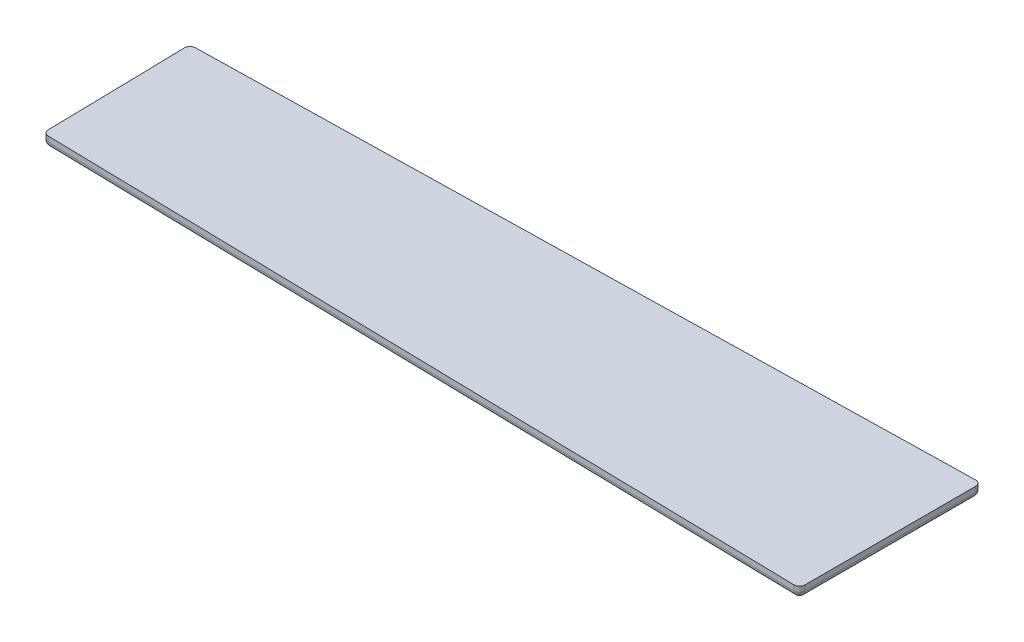
ISO-10303-21;
HEADER;
FILE_DESCRIPTION(('STEP AP214'),'2;1');
FILE_NAME('part.step','',(''),(''),'','','');
FILE_SCHEMA(('AUTOMOTIVE_DESIGN { 1 0 10303 214 1 1 1 1 }'));
ENDSEC;
DATA;
#1=APPLICATION_CONTEXT('core data for automotive mechanical design processes');
#2=APPLICATION_PROTOCOL_DEFINITION('international standard','automotive_design',2000,#1);
#3=PRODUCT_CONTEXT('',#1,'mechanical');
#4=PRODUCT('Part','Part','',(#3));
#5=PRODUCT_RELATED_PRODUCT_CATEGORY('part','',(#4));
#6=PRODUCT_DEFINITION_FORMATION('','',#4);
#7=PRODUCT_DEFINITION_CONTEXT('part definition',#1,'design');
#8=PRODUCT_DEFINITION('design','',#6,#7);
#9=PRODUCT_DEFINITION_SHAPE('','',#8);
#10=(LENGTH_UNIT() NAMED_UNIT(*) SI_UNIT(.MILLI.,.METRE.));
#11=(NAMED_UNIT(*) PLANE_ANGLE_UNIT() SI_UNIT($,.RADIAN.));
#12=(NAMED_UNIT(*) SI_UNIT($,.STERADIAN.) SOLID_ANGLE_UNIT());
#13=UNCERTAINTY_MEASURE_WITH_UNIT(LENGTH_MEASURE(1.E-05),#10,'distance_accuracy_value','');
#14=(GEOMETRIC_REPRESENTATION_CONTEXT(3) GLOBAL_UNCERTAINTY_ASSIGNED_CONTEXT((#13)) GLOBAL_UNIT_ASSIGNED_CONTEXT((#10,
#11,#12)) REPRESENTATION_CONTEXT('',''));
#15=CARTESIAN_POINT('',(0.,0.,0.));
#16=DIRECTION('',(0.,0.,1.));
#17=DIRECTION('',(1.,0.,0.));
#18=AXIS2_PLACEMENT_3D('',#15,#16,#17);
#19=CARTESIAN_POINT('',(92.0552909940542,2.54,-21.59));
#20=DIRECTION('',(0.0206896551724107,0.,0.999785946174903));
#21=DIRECTION('',(0.999785946174903,0.,-0.0206896551724107));
#22=AXIS2_PLACEMENT_3D('',#19,#20,#21);
#23=PLANE('',#22);
#24=DIRECTION('',(-0.999785946174903,0.,0.0206896551724107));
#25=VECTOR('',#24,1.);
#26=CARTESIAN_POINT('',(92.0552909940542,1.27,-21.59));
#27=LINE('',#26,#25);
#28=CARTESIAN_POINT('',(90.7590151319853,1.27,-21.5631747573597));
#29=VERTEX_POINT('',#28);
#30=CARTESIAN_POINT('',(-90.7855628424121,1.27,-17.8062758620695));
#31=VERTEX_POINT('',#30);
#32=EDGE_CURVE('E169',#29,#31,#27,.T.);
#33=ORIENTED_EDGE('',*,*,#32,.T.);
#34=DIRECTION('',(0.,-1.,0.));
#35=VECTOR('',#34,1.);
#36=CARTESIAN_POINT('',(-90.7855628424121,2.54,-17.8062758620695));
#37=LINE('',#36,#35);
#38=CARTESIAN_POINT('',(-90.7855628424121,2.54,-17.8062758620695));
#39=VERTEX_POINT('',#38);
#40=EDGE_CURVE('E209',#31,#39,#37,.F.);
#41=ORIENTED_EDGE('',*,*,#40,.T.);
#42=DIRECTION('',(-0.999785946174903,0.,0.0206896551724107));
#43=VECTOR('',#42,1.);
#44=CARTESIAN_POINT('',(92.0552909940542,2.54,-21.59));
#45=LINE('',#44,#43);
#46=CARTESIAN_POINT('',(90.7590151319853,2.54,-21.5631747573597));
#47=VERTEX_POINT('',#46);
#48=EDGE_CURVE('E234',#47,#39,#45,.T.);
#49=ORIENTED_EDGE('',*,*,#48,.F.);
#50=DIRECTION('',(0.,-1.,0.));
#51=VECTOR('',#50,1.);
#52=CARTESIAN_POINT('',(90.7590151319853,2.54,-21.5631747573597));
#53=LINE('',#52,#51);
#54=EDGE_CURVE('E206',#47,#29,#53,.T.);
#55=ORIENTED_EDGE('',*,*,#54,.T.);
#56=EDGE_LOOP('',(#33,#41,#49,#55));
#57=FACE_BOUND('',#56,.T.);
#58=ADVANCED_FACE('F46',(#57),#23,.F.);
#59=CARTESIAN_POINT('',(-92.0552909940542,2.54,-17.7800000000006));
#60=DIRECTION('',(0.999785946174903,0.,-0.0206896551724128));
#61=DIRECTION('',(-0.0206896551724128,0.,-0.999785946174903));
#62=AXIS2_PLACEMENT_3D('',#59,#60,#61);
#63=PLANE('',#62);
#64=DIRECTION('',(0.0206896551724128,0.,0.999785946174903));
#65=VECTOR('',#64,1.);
#66=CARTESIAN_POINT('',(-92.0552909940542,2.54,-17.7800000000006));
#67=LINE('',#66,#65);
#68=CARTESIAN_POINT('',(-92.0290151319853,2.54,-16.5102718483584));
#69=VERTEX_POINT('',#68);
#70=CARTESIAN_POINT('',(-91.3443044660526,2.54,16.5769930330941));
#71=VERTEX_POINT('',#70);
#72=EDGE_CURVE('E278',#69,#71,#67,.T.);
#73=ORIENTED_EDGE('',*,*,#72,.F.);
#74=DIRECTION('',(0.,-1.,0.));
#75=VECTOR('',#74,1.);
#76=CARTESIAN_POINT('',(-92.0290151319853,2.54,-16.5102718483584));
#77=LINE('',#76,#75);
#78=CARTESIAN_POINT('',(-92.0290151319853,1.27,-16.5102718483584));
#79=VERTEX_POINT('',#78);
#80=EDGE_CURVE('E203',#69,#79,#77,.T.);
#81=ORIENTED_EDGE('',*,*,#80,.T.);
#82=DIRECTION('',(0.0206896551724128,0.,0.999785946174903));
#83=VECTOR('',#82,1.);
#84=CARTESIAN_POINT('',(-92.0552909940542,1.27,-17.7800000000006));
#85=LINE('',#84,#83);
#86=CARTESIAN_POINT('',(-91.3443044660526,1.27,16.5769930330941));
#87=VERTEX_POINT('',#86);
#88=EDGE_CURVE('E174',#79,#87,#85,.T.);
#89=ORIENTED_EDGE('',*,*,#88,.T.);
#90=DIRECTION('',(0.,-1.,0.));
#91=VECTOR('',#90,1.);
#92=CARTESIAN_POINT('',(-91.3443044660526,2.54,16.5769930330941));
#93=LINE('',#92,#91);
#94=EDGE_CURVE('E150',#87,#71,#93,.F.);
#95=ORIENTED_EDGE('',*,*,#94,.T.);
#96=EDGE_LOOP('',(#73,#81,#89,#95));
#97=FACE_BOUND('',#96,.T.);
#98=ADVANCED_FACE('F300',(#97),#63,.F.);
#99=CARTESIAN_POINT('',(-91.3190940650782,2.54,17.7952349216928));
#100=DIRECTION('',(0.0206896551724138,0.,-0.999785946174903));
#101=DIRECTION('',(-0.999785946174903,0.,-0.0206896551724138));
#102=AXIS2_PLACEMENT_3D('',#99,#100,#101);
#103=PLANE('',#102);
#104=DIRECTION('',(0.999785946174903,0.,0.0206896551724138));
#105=VECTOR('',#104,1.);
#106=CARTESIAN_POINT('',(-91.3190940650782,2.54,17.7952349216928));
#107=LINE('',#106,#105);
#108=CARTESIAN_POINT('',(-90.1008521764794,2.54,17.8204453226672));
#109=VERTEX_POINT('',#108);
#110=CARTESIAN_POINT('',(90.7590151319853,2.54,21.5631747573597));
#111=VERTEX_POINT('',#110);
#112=EDGE_CURVE('E253',#109,#111,#107,.T.);
#113=ORIENTED_EDGE('',*,*,#112,.F.);
#114=DIRECTION('',(0.,-1.,0.));
#115=VECTOR('',#114,1.);
#116=CARTESIAN_POINT('',(-90.1008521764794,2.54,17.8204453226672));
#117=LINE('',#116,#115);
#118=CARTESIAN_POINT('',(-90.1008521764794,1.27,17.8204453226672));
#119=VERTEX_POINT('',#118);
#120=EDGE_CURVE('E226',#109,#119,#117,.T.);
#121=ORIENTED_EDGE('',*,*,#120,.T.);
#122=DIRECTION('',(0.999785946174903,0.,0.0206896551724138));
#123=VECTOR('',#122,1.);
#124=CARTESIAN_POINT('',(-91.3190940650782,1.27,17.7952349216928));
#125=LINE('',#124,#123);
#126=CARTESIAN_POINT('',(90.7590151319853,1.27,21.5631747573597));
#127=VERTEX_POINT('',#126);
#128=EDGE_CURVE('E182',#119,#127,#125,.T.);
#129=ORIENTED_EDGE('',*,*,#128,.T.);
#130=DIRECTION('',(0.,-1.,0.));
#131=VECTOR('',#130,1.);
#132=CARTESIAN_POINT('',(90.7590151319853,2.54,21.5631747573597));
#133=LINE('',#132,#131);
#134=EDGE_CURVE('E223',#127,#111,#133,.F.);
#135=ORIENTED_EDGE('',*,*,#134,.T.);
#136=EDGE_LOOP('',(#113,#121,#129,#135));
#137=FACE_BOUND('',#136,.T.);
#138=ADVANCED_FACE('F290',(#137),#103,.F.);
#139=CARTESIAN_POINT('',(92.0552909940542,2.54,21.59));
#140=DIRECTION('',(-1.,0.,0.));
#141=DIRECTION('',(0.,0.,1.));
#142=AXIS2_PLACEMENT_3D('',#139,#140,#141);
#143=PLANE('',#142);
#144=DIRECTION('',(0.,0.,-1.));
#145=VECTOR('',#144,1.);
#146=CARTESIAN_POINT('',(92.0552909940542,2.54,21.59));
#147=LINE('',#146,#145);
#148=CARTESIAN_POINT('',(92.0552909940542,2.54,20.2934466057175));
#149=VERTEX_POINT('',#148);
#150=CARTESIAN_POINT('',(92.0552909940542,2.54,-20.2934466057176));
#151=VERTEX_POINT('',#150);
#152=EDGE_CURVE('E250',#149,#151,#147,.T.);
#153=ORIENTED_EDGE('',*,*,#152,.F.);
#154=DIRECTION('',(0.,-1.,0.));
#155=VECTOR('',#154,1.);
#156=CARTESIAN_POINT('',(92.0552909940542,2.54,20.2934466057175));
#157=LINE('',#156,#155);
#158=CARTESIAN_POINT('',(92.0552909940542,1.27,20.2934466057175));
#159=VERTEX_POINT('',#158);
#160=EDGE_CURVE('E11',#149,#159,#157,.T.);
#161=ORIENTED_EDGE('',*,*,#160,.T.);
#162=DIRECTION('',(0.,0.,-1.));
#163=VECTOR('',#162,1.);
#164=CARTESIAN_POINT('',(92.0552909940542,1.27,21.59));
#165=LINE('',#164,#163);
#166=CARTESIAN_POINT('',(92.0552909940542,1.27,-20.2934466057176));
#167=VERTEX_POINT('',#166);
#168=EDGE_CURVE('E148',#159,#167,#165,.T.);
#169=ORIENTED_EDGE('',*,*,#168,.T.);
#170=DIRECTION('',(0.,-1.,0.));
#171=VECTOR('',#170,1.);
#172=CARTESIAN_POINT('',(92.0552909940542,2.54,-20.2934466057176));
#173=LINE('',#172,#171);
#174=EDGE_CURVE('E56',#167,#151,#173,.F.);
#175=ORIENTED_EDGE('',*,*,#174,.T.);
#176=EDGE_LOOP('',(#153,#161,#169,#175));
#177=FACE_BOUND('',#176,.T.);
#178=ADVANCED_FACE('F247',(#177),#143,.F.);
#179=CARTESIAN_POINT('',(0.,2.54,0.));
#180=DIRECTION('',(0.,1.,0.));
#181=DIRECTION('',(0.,0.,1.));
#182=AXIS2_PLACEMENT_3D('',#179,#180,#181);
#183=PLANE('',#182);
#184=ORIENTED_EDGE('',*,*,#48,.T.);
#185=CARTESIAN_POINT('',(-90.7592869803431,2.54,-16.5365477104274));
#186=DIRECTION('',(0.,1.,0.));
#187=DIRECTION('',(0.,0.,1.));
#188=AXIS2_PLACEMENT_3D('',#185,#186,#187);
#189=CIRCLE('',#188,1.27);
#190=EDGE_CURVE('E220',#39,#69,#189,.T.);
#191=ORIENTED_EDGE('',*,*,#190,.T.);
#192=ORIENTED_EDGE('',*,*,#72,.T.);
#193=CARTESIAN_POINT('',(-90.0745763144105,2.54,16.5507171710251));
#194=DIRECTION('',(0.,1.,0.));
#195=DIRECTION('',(0.,0.,1.));
#196=AXIS2_PLACEMENT_3D('',#193,#194,#195);
#197=CIRCLE('',#196,1.27);
#198=EDGE_CURVE('E217',#71,#109,#197,.T.);
#199=ORIENTED_EDGE('',*,*,#198,.T.);
#200=ORIENTED_EDGE('',*,*,#112,.T.);
#201=CARTESIAN_POINT('',(90.7852909940543,2.54,20.2934466057175));
#202=DIRECTION('',(0.,1.,0.));
#203=DIRECTION('',(0.,0.,1.));
#204=AXIS2_PLACEMENT_3D('',#201,#202,#203);
#205=CIRCLE('',#204,1.27);
#206=EDGE_CURVE('E70',#111,#149,#205,.T.);
#207=ORIENTED_EDGE('',*,*,#206,.T.);
#208=ORIENTED_EDGE('',*,*,#152,.T.);
#209=CARTESIAN_POINT('',(90.7852909940543,2.54,-20.2934466057175));
#210=DIRECTION('',(0.,1.,0.));
#211=DIRECTION('',(0.,0.,1.));
#212=AXIS2_PLACEMENT_3D('',#209,#210,#211);
#213=CIRCLE('',#212,1.27);
#214=EDGE_CURVE('E212',#151,#47,#213,.T.);
#215=ORIENTED_EDGE('',*,*,#214,.T.);
#216=EDGE_LOOP('',(#184,#191,#192,#199,#200,#207,#208,#215));
#217=FACE_BOUND('',#216,.T.);
#218=ADVANCED_FACE('F274',(#217),#183,.T.);
#219=CARTESIAN_POINT('',(0.,0.,0.));
#220=DIRECTION('',(0.,1.,0.));
#221=DIRECTION('',(0.,0.,1.));
#222=AXIS2_PLACEMENT_3D('',#219,#220,#221);
#223=PLANE('',#222);
#224=DIRECTION('',(-0.999785946174903,0.,0.0206896551724107));
#225=VECTOR('',#224,1.);
#226=CARTESIAN_POINT('',(-0.380912821043803,0.,-18.4068454512119));
#227=LINE('',#226,#225);
#228=CARTESIAN_POINT('',(-90.7592869803431,0.,-16.5365477104274));
#229=VERTEX_POINT('',#228);
#230=CARTESIAN_POINT('',(90.7852909940543,0.,-20.2934466057175));
#231=VERTEX_POINT('',#230);
#232=EDGE_CURVE('E167',#229,#231,#227,.F.);
#233=ORIENTED_EDGE('',*,*,#232,.T.);
#234=DIRECTION('',(0.,0.,-1.));
#235=VECTOR('',#234,1.);
#236=CARTESIAN_POINT('',(90.7852909940543,0.,0.));
#237=LINE('',#236,#235);
#238=CARTESIAN_POINT('',(90.7852909940543,0.,20.2934466057175));
#239=VERTEX_POINT('',#238);
#240=EDGE_CURVE('E146',#231,#239,#237,.F.);
#241=ORIENTED_EDGE('',*,*,#240,.T.);
#242=DIRECTION('',(0.999785946174903,0.,0.0206896551724138));
#243=VECTOR('',#242,1.);
#244=CARTESIAN_POINT('',(-0.380912821043854,0.,18.4068454512116));
#245=LINE('',#244,#243);
#246=CARTESIAN_POINT('',(-90.0745763144105,0.,16.5507171710251));
#247=VERTEX_POINT('',#246);
#248=EDGE_CURVE('E155',#239,#247,#245,.F.);
#249=ORIENTED_EDGE('',*,*,#248,.T.);
#250=DIRECTION('',(0.0206896551724128,0.,0.999785946174903));
#251=VECTOR('',#250,1.);
#252=CARTESIAN_POINT('',(-90.3783741592993,0.,1.87029774078469));
#253=LINE('',#252,#251);
#254=EDGE_CURVE('E162',#247,#229,#253,.F.);
#255=ORIENTED_EDGE('',*,*,#254,.T.);
#256=EDGE_LOOP('',(#233,#241,#249,#255));
#257=FACE_BOUND('',#256,.T.);
#258=ADVANCED_FACE('F165',(#257),#223,.F.);
#259=CARTESIAN_POINT('',(-90.7855628424121,1.27,-17.8062758620695));
#260=DIRECTION('',(0.0206896551724128,0.,0.999785946174903));
#261=DIRECTION('',(0.999785946174903,0.,-0.0206896551724128));
#262=AXIS2_PLACEMENT_3D('',#259,#260,#261);
#263=CYLINDRICAL_SURFACE('',#262,1.27);
#264=ORIENTED_EDGE('',*,*,#88,.F.);
#265=CARTESIAN_POINT('',(-90.7592869803431,1.27,-16.5365477104274));
#266=DIRECTION('',(0.0206896551724128,0.,0.999785946174903));
#267=DIRECTION('',(0.999785946174903,0.,-0.0206896551724128));
#268=AXIS2_PLACEMENT_3D('',#265,#266,#267);
#269=CIRCLE('',#268,1.27);
#270=EDGE_CURVE('E138',#79,#229,#269,.T.);
#271=ORIENTED_EDGE('',*,*,#270,.T.);
#272=ORIENTED_EDGE('',*,*,#254,.F.);
#273=CARTESIAN_POINT('',(-90.0745763144105,1.27,16.5507171710251));
#274=DIRECTION('',(0.0206896551724128,0.,0.999785946174903));
#275=DIRECTION('',(0.999785946174903,0.,-0.0206896551724128));
#276=AXIS2_PLACEMENT_3D('',#273,#274,#275);
#277=CIRCLE('',#276,1.27);
#278=EDGE_CURVE('E192',#247,#87,#277,.F.);
#279=ORIENTED_EDGE('',*,*,#278,.T.);
#280=EDGE_LOOP('',(#264,#271,#272,#279));
#281=FACE_BOUND('',#280,.T.);
#282=ADVANCED_FACE('F298',(#281),#263,.T.);
#283=CARTESIAN_POINT('',(-91.2928182030092,1.27,16.5255067700506));
#284=DIRECTION('',(0.999785946174903,0.,0.0206896551724138));
#285=DIRECTION('',(0.0206896551724138,0.,-0.999785946174903));
#286=AXIS2_PLACEMENT_3D('',#283,#284,#285);
#287=CYLINDRICAL_SURFACE('',#286,1.27);
#288=ORIENTED_EDGE('',*,*,#128,.F.);
#289=CARTESIAN_POINT('',(-90.0745763144105,1.27,16.5507171710251));
#290=DIRECTION('',(0.999785946174903,0.,0.0206896551724138));
#291=DIRECTION('',(0.0206896551724138,0.,-0.999785946174903));
#292=AXIS2_PLACEMENT_3D('',#289,#290,#291);
#293=CIRCLE('',#292,1.27);
#294=EDGE_CURVE('E137',#119,#247,#293,.T.);
#295=ORIENTED_EDGE('',*,*,#294,.T.);
#296=ORIENTED_EDGE('',*,*,#248,.F.);
#297=CARTESIAN_POINT('',(90.7852909940543,1.27,20.2934466057175));
#298=DIRECTION('',(0.999785946174903,0.,0.0206896551724138));
#299=DIRECTION('',(0.0206896551724138,0.,-0.999785946174903));
#300=AXIS2_PLACEMENT_3D('',#297,#298,#299);
#301=CIRCLE('',#300,1.27);
#302=EDGE_CURVE('E126',#239,#127,#301,.F.);
#303=ORIENTED_EDGE('',*,*,#302,.T.);
#304=EDGE_LOOP('',(#288,#295,#296,#303));
#305=FACE_BOUND('',#304,.T.);
#306=ADVANCED_FACE('F156',(#305),#287,.T.);
#307=CARTESIAN_POINT('',(92.0815668561232,1.27,-20.3202718483579));
#308=DIRECTION('',(-0.999785946174903,0.,0.0206896551724107));
#309=DIRECTION('',(0.0206896551724107,0.,0.999785946174903));
#310=AXIS2_PLACEMENT_3D('',#307,#308,#309);
#311=CYLINDRICAL_SURFACE('',#310,1.27);
#312=ORIENTED_EDGE('',*,*,#232,.F.);
#313=CARTESIAN_POINT('',(-90.7592869803431,1.27,-16.5365477104274));
#314=DIRECTION('',(-0.999785946174903,0.,0.0206896551724107));
#315=DIRECTION('',(0.0206896551724107,0.,0.999785946174903));
#316=AXIS2_PLACEMENT_3D('',#313,#314,#315);
#317=CIRCLE('',#316,1.27);
#318=EDGE_CURVE('E188',#229,#31,#317,.F.);
#319=ORIENTED_EDGE('',*,*,#318,.T.);
#320=ORIENTED_EDGE('',*,*,#32,.F.);
#321=CARTESIAN_POINT('',(90.7852909940543,1.27,-20.2934466057175));
#322=DIRECTION('',(-0.999785946174903,0.,0.0206896551724107));
#323=DIRECTION('',(0.0206896551724107,0.,0.999785946174903));
#324=AXIS2_PLACEMENT_3D('',#321,#322,#323);
#325=CIRCLE('',#324,1.27);
#326=EDGE_CURVE('E185',#29,#231,#325,.T.);
#327=ORIENTED_EDGE('',*,*,#326,.T.);
#328=EDGE_LOOP('',(#312,#319,#320,#327));
#329=FACE_BOUND('',#328,.T.);
#330=ADVANCED_FACE('F260',(#329),#311,.T.);
#331=CARTESIAN_POINT('',(90.7852909940543,1.27,21.59));
#332=DIRECTION('',(0.,0.,-1.));
#333=DIRECTION('',(-1.,0.,0.));
#334=AXIS2_PLACEMENT_3D('',#331,#332,#333);
#335=CYLINDRICAL_SURFACE('',#334,1.27);
#336=ORIENTED_EDGE('',*,*,#168,.F.);
#337=CARTESIAN_POINT('',(90.7852909940543,1.27,20.2934466057175));
#338=DIRECTION('',(0.,0.,-1.));
#339=DIRECTION('',(-1.,0.,0.));
#340=AXIS2_PLACEMENT_3D('',#337,#338,#339);
#341=CIRCLE('',#340,1.27);
#342=EDGE_CURVE('E129',#159,#239,#341,.T.);
#343=ORIENTED_EDGE('',*,*,#342,.T.);
#344=ORIENTED_EDGE('',*,*,#240,.F.);
#345=CARTESIAN_POINT('',(90.7852909940543,1.27,-20.2934466057176));
#346=DIRECTION('',(0.,0.,-1.));
#347=DIRECTION('',(-1.,0.,0.));
#348=AXIS2_PLACEMENT_3D('',#345,#346,#347);
#349=CIRCLE('',#348,1.27);
#350=EDGE_CURVE('E151',#231,#167,#349,.F.);
#351=ORIENTED_EDGE('',*,*,#350,.T.);
#352=EDGE_LOOP('',(#336,#343,#344,#351));
#353=FACE_BOUND('',#352,.T.);
#354=ADVANCED_FACE('F143',(#353),#335,.T.);
#355=CARTESIAN_POINT('',(-90.7592869803431,2.54,-16.5365477104274));
#356=DIRECTION('',(0.,-1.,0.));
#357=DIRECTION('',(0.,0.,-1.));
#358=AXIS2_PLACEMENT_3D('',#355,#356,#357);
#359=CYLINDRICAL_SURFACE('',#358,1.27);
#360=ORIENTED_EDGE('',*,*,#190,.F.);
#361=ORIENTED_EDGE('',*,*,#40,.F.);
#362=CARTESIAN_POINT('',(-90.7592869803431,1.27,-16.5365477104274));
#363=DIRECTION('',(0.,-1.,0.));
#364=DIRECTION('',(0.,0.,-1.));
#365=AXIS2_PLACEMENT_3D('',#362,#363,#364);
#366=CIRCLE('',#365,1.27);
#367=EDGE_CURVE('E231',#79,#31,#366,.T.);
#368=ORIENTED_EDGE('',*,*,#367,.F.);
#369=ORIENTED_EDGE('',*,*,#80,.F.);
#370=EDGE_LOOP('',(#360,#361,#368,#369));
#371=FACE_BOUND('',#370,.T.);
#372=ADVANCED_FACE('F270',(#371),#359,.T.);
#373=CARTESIAN_POINT('',(-90.7592869803431,1.27,-16.5365477104274));
#374=DIRECTION('',(0.,0.,1.));
#375=DIRECTION('',(1.,0.,0.));
#376=AXIS2_PLACEMENT_3D('',#373,#374,#375);
#377=SPHERICAL_SURFACE('',#376,1.27);
#378=ORIENTED_EDGE('',*,*,#318,.F.);
#379=ORIENTED_EDGE('',*,*,#270,.F.);
#380=ORIENTED_EDGE('',*,*,#367,.T.);
#381=EDGE_LOOP('',(#378,#379,#380));
#382=FACE_BOUND('',#381,.T.);
#383=ADVANCED_FACE('F264',(#382),#377,.T.);
#384=CARTESIAN_POINT('',(-90.0745763144105,2.54,16.5507171710251));
#385=DIRECTION('',(0.,-1.,0.));
#386=DIRECTION('',(0.,0.,-1.));
#387=AXIS2_PLACEMENT_3D('',#384,#385,#386);
#388=CYLINDRICAL_SURFACE('',#387,1.27);
#389=ORIENTED_EDGE('',*,*,#198,.F.);
#390=ORIENTED_EDGE('',*,*,#94,.F.);
#391=CARTESIAN_POINT('',(-90.0745763144105,1.27,16.5507171710251));
#392=DIRECTION('',(0.,-1.,0.));
#393=DIRECTION('',(0.,0.,-1.));
#394=AXIS2_PLACEMENT_3D('',#391,#392,#393);
#395=CIRCLE('',#394,1.27);
#396=EDGE_CURVE('E235',#119,#87,#395,.T.);
#397=ORIENTED_EDGE('',*,*,#396,.F.);
#398=ORIENTED_EDGE('',*,*,#120,.F.);
#399=EDGE_LOOP('',(#389,#390,#397,#398));
#400=FACE_BOUND('',#399,.T.);
#401=ADVANCED_FACE('F294',(#400),#388,.T.);
#402=CARTESIAN_POINT('',(-90.0745763144105,1.27,16.5507171710251));
#403=DIRECTION('',(0.,0.,1.));
#404=DIRECTION('',(1.,0.,0.));
#405=AXIS2_PLACEMENT_3D('',#402,#403,#404);
#406=SPHERICAL_SURFACE('',#405,1.27);
#407=ORIENTED_EDGE('',*,*,#396,.T.);
#408=ORIENTED_EDGE('',*,*,#278,.F.);
#409=ORIENTED_EDGE('',*,*,#294,.F.);
#410=EDGE_LOOP('',(#407,#408,#409));
#411=FACE_BOUND('',#410,.T.);
#412=ADVANCED_FACE('F296',(#411),#406,.T.);
#413=CARTESIAN_POINT('',(90.7852909940543,2.54,20.2934466057175));
#414=DIRECTION('',(0.,-1.,0.));
#415=DIRECTION('',(0.,0.,-1.));
#416=AXIS2_PLACEMENT_3D('',#413,#414,#415);
#417=CYLINDRICAL_SURFACE('',#416,1.27);
#418=ORIENTED_EDGE('',*,*,#206,.F.);
#419=ORIENTED_EDGE('',*,*,#134,.F.);
#420=CARTESIAN_POINT('',(90.7852909940543,1.27,20.2934466057175));
#421=DIRECTION('',(0.,-1.,0.));
#422=DIRECTION('',(0.,0.,-1.));
#423=AXIS2_PLACEMENT_3D('',#420,#421,#422);
#424=CIRCLE('',#423,1.27);
#425=EDGE_CURVE('E131',#159,#127,#424,.T.);
#426=ORIENTED_EDGE('',*,*,#425,.F.);
#427=ORIENTED_EDGE('',*,*,#160,.F.);
#428=EDGE_LOOP('',(#418,#419,#426,#427));
#429=FACE_BOUND('',#428,.T.);
#430=ADVANCED_FACE('F289',(#429),#417,.T.);
#431=CARTESIAN_POINT('',(90.7852909940543,1.27,20.2934466057175));
#432=DIRECTION('',(0.,0.,1.));
#433=DIRECTION('',(1.,0.,0.));
#434=AXIS2_PLACEMENT_3D('',#431,#432,#433);
#435=SPHERICAL_SURFACE('',#434,1.27);
#436=ORIENTED_EDGE('',*,*,#425,.T.);
#437=ORIENTED_EDGE('',*,*,#302,.F.);
#438=ORIENTED_EDGE('',*,*,#342,.F.);
#439=EDGE_LOOP('',(#436,#437,#438));
#440=FACE_BOUND('',#439,.T.);
#441=ADVANCED_FACE('F128',(#440),#435,.T.);
#442=CARTESIAN_POINT('',(90.7852909940543,2.54,-20.2934466057175));
#443=DIRECTION('',(0.,-1.,0.));
#444=DIRECTION('',(0.,0.,-1.));
#445=AXIS2_PLACEMENT_3D('',#442,#443,#444);
#446=CYLINDRICAL_SURFACE('',#445,1.27);
#447=ORIENTED_EDGE('',*,*,#214,.F.);
#448=ORIENTED_EDGE('',*,*,#174,.F.);
#449=CARTESIAN_POINT('',(90.7852909940543,1.27,-20.2934466057175));
#450=DIRECTION('',(0.,-1.,0.));
#451=DIRECTION('',(0.,0.,-1.));
#452=AXIS2_PLACEMENT_3D('',#449,#450,#451);
#453=CIRCLE('',#452,1.27);
#454=EDGE_CURVE('E50',#29,#167,#453,.T.);
#455=ORIENTED_EDGE('',*,*,#454,.F.);
#456=ORIENTED_EDGE('',*,*,#54,.F.);
#457=EDGE_LOOP('',(#447,#448,#455,#456));
#458=FACE_BOUND('',#457,.T.);
#459=ADVANCED_FACE('F48',(#458),#446,.T.);
#460=CARTESIAN_POINT('',(90.7852909940543,1.27,-20.2934466057176));
#461=DIRECTION('',(0.,0.,1.));
#462=DIRECTION('',(1.,0.,0.));
#463=AXIS2_PLACEMENT_3D('',#460,#461,#462);
#464=SPHERICAL_SURFACE('',#463,1.27);
#465=ORIENTED_EDGE('',*,*,#350,.F.);
#466=ORIENTED_EDGE('',*,*,#326,.F.);
#467=ORIENTED_EDGE('',*,*,#454,.T.);
#468=EDGE_LOOP('',(#465,#466,#467));
#469=FACE_BOUND('',#468,.T.);
#470=ADVANCED_FACE('F243',(#469),#464,.T.);
#471=CLOSED_SHELL('',(#58,#98,#138,#178,#218,#258,#282,#306,#330,#354,#372,#383,#401,#412,#430,
#441,#459,#470));
#472=MANIFOLD_SOLID_BREP('B2',#471);
#473=ADVANCED_BREP_SHAPE_REPRESENTATION('',(#18,#472),#14);
#474=SHAPE_DEFINITION_REPRESENTATION(#9,#473);
ENDSEC;
END-ISO-10303-21;
